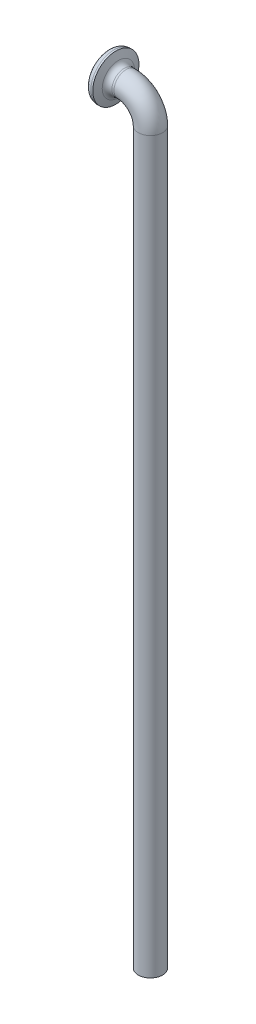
ISO-10303-21;
HEADER;
FILE_DESCRIPTION(('STEP AP214'),'2;1');
FILE_NAME('part.step','',(''),(''),'','','');
FILE_SCHEMA(('AUTOMOTIVE_DESIGN { 1 0 10303 214 1 1 1 1 }'));
ENDSEC;
DATA;
#1=APPLICATION_CONTEXT('core data for automotive mechanical design processes');
#2=APPLICATION_PROTOCOL_DEFINITION('international standard','automotive_design',2000,#1);
#3=PRODUCT_CONTEXT('',#1,'mechanical');
#4=PRODUCT('Part','Part','',(#3));
#5=PRODUCT_RELATED_PRODUCT_CATEGORY('part','',(#4));
#6=PRODUCT_DEFINITION_FORMATION('','',#4);
#7=PRODUCT_DEFINITION_CONTEXT('part definition',#1,'design');
#8=PRODUCT_DEFINITION('design','',#6,#7);
#9=PRODUCT_DEFINITION_SHAPE('','',#8);
#10=(LENGTH_UNIT() NAMED_UNIT(*) SI_UNIT(.MILLI.,.METRE.));
#11=(NAMED_UNIT(*) PLANE_ANGLE_UNIT() SI_UNIT($,.RADIAN.));
#12=(NAMED_UNIT(*) SI_UNIT($,.STERADIAN.) SOLID_ANGLE_UNIT());
#13=UNCERTAINTY_MEASURE_WITH_UNIT(LENGTH_MEASURE(1.E-05),#10,'distance_accuracy_value','');
#14=(GEOMETRIC_REPRESENTATION_CONTEXT(3) GLOBAL_UNCERTAINTY_ASSIGNED_CONTEXT((#13)) GLOBAL_UNIT_ASSIGNED_CONTEXT((#10,
#11,#12)) REPRESENTATION_CONTEXT('',''));
#15=CARTESIAN_POINT('',(0.,0.,0.));
#16=DIRECTION('',(0.,0.,1.));
#17=DIRECTION('',(1.,0.,0.));
#18=AXIS2_PLACEMENT_3D('',#15,#16,#17);
#19=CARTESIAN_POINT('',(-2.,62.,0.));
#20=DIRECTION('',(-1.,0.,0.));
#21=DIRECTION('',(0.,-1.,0.));
#22=AXIS2_PLACEMENT_3D('',#19,#20,#21);
#23=CYLINDRICAL_SURFACE('',#22,1.);
#24=CARTESIAN_POINT('',(-2.16827837145488,62.,0.));
#25=DIRECTION('',(1.,0.,0.));
#26=DIRECTION('',(0.,1.,0.));
#27=AXIS2_PLACEMENT_3D('',#24,#25,#26);
#28=CIRCLE('',#27,1.);
#29=CARTESIAN_POINT('',(-2.16827837145487,63.,0.));
#30=VERTEX_POINT('',#29);
#31=EDGE_CURVE('E58',#30,#30,#28,.T.);
#32=ORIENTED_EDGE('',*,*,#31,.T.);
#33=EDGE_LOOP('',(#32));
#34=FACE_BOUND('',#33,.T.);
#35=CARTESIAN_POINT('',(-1.9999999999997,62.,0.));
#36=DIRECTION('',(1.,0.,0.));
#37=DIRECTION('',(0.,1.,0.));
#38=AXIS2_PLACEMENT_3D('',#35,#36,#37);
#39=CIRCLE('',#38,1.);
#40=CARTESIAN_POINT('',(-1.99999999999955,63.,0.));
#41=VERTEX_POINT('',#40);
#42=EDGE_CURVE('E74',#41,#41,#39,.T.);
#43=ORIENTED_EDGE('',*,*,#42,.F.);
#44=EDGE_LOOP('',(#43));
#45=FACE_BOUND('',#44,.T.);
#46=ADVANCED_FACE('F51',(#34,#45),#23,.T.);
#47=CARTESIAN_POINT('',(0.,0.,0.));
#48=DIRECTION('',(0.,-1.,0.));
#49=DIRECTION('',(1.,0.,0.));
#50=AXIS2_PLACEMENT_3D('',#47,#48,#49);
#51=PLANE('',#50);
#52=CARTESIAN_POINT('',(0.,0.,0.));
#53=DIRECTION('',(0.,-1.,0.));
#54=DIRECTION('',(1.,0.,0.));
#55=AXIS2_PLACEMENT_3D('',#52,#53,#54);
#56=CIRCLE('',#55,1.);
#57=CARTESIAN_POINT('',(1.,0.,0.));
#58=VERTEX_POINT('',#57);
#59=EDGE_CURVE('E80',#58,#58,#56,.T.);
#60=ORIENTED_EDGE('',*,*,#59,.T.);
#61=EDGE_LOOP('',(#60));
#62=FACE_BOUND('',#61,.T.);
#63=ADVANCED_FACE('F84',(#62),#51,.T.);
#64=CARTESIAN_POINT('',(0.,0.,0.));
#65=DIRECTION('',(0.,1.,0.));
#66=DIRECTION('',(0.,0.,1.));
#67=AXIS2_PLACEMENT_3D('',#64,#65,#66);
#68=CYLINDRICAL_SURFACE('',#67,1.);
#69=CARTESIAN_POINT('',(0.,60.,0.));
#70=DIRECTION('',(0.,-1.,0.));
#71=DIRECTION('',(1.,0.,0.));
#72=AXIS2_PLACEMENT_3D('',#69,#70,#71);
#73=CIRCLE('',#72,1.);
#74=CARTESIAN_POINT('',(1.,60.,0.));
#75=VERTEX_POINT('',#74);
#76=EDGE_CURVE('E77',#75,#75,#73,.T.);
#77=ORIENTED_EDGE('',*,*,#76,.T.);
#78=EDGE_LOOP('',(#77));
#79=FACE_BOUND('',#78,.T.);
#80=ORIENTED_EDGE('',*,*,#59,.F.);
#81=EDGE_LOOP('',(#80));
#82=FACE_BOUND('',#81,.T.);
#83=ADVANCED_FACE('F86',(#79,#82),#68,.T.);
#84=CARTESIAN_POINT('',(-2.,60.,0.));
#85=DIRECTION('',(0.,0.,1.));
#86=DIRECTION('',(1.,0.,0.));
#87=AXIS2_PLACEMENT_3D('',#84,#85,#86);
#88=TOROIDAL_SURFACE('',#87,2.,1.);
#89=CARTESIAN_POINT('',(-2.,60.,0.));
#90=DIRECTION('',(0.,0.,1.));
#91=DIRECTION('',(1.,0.,0.));
#92=AXIS2_PLACEMENT_3D('',#89,#90,#91);
#93=CIRCLE('',#92,3.);
#94=EDGE_CURVE('',#75,#41,#93,.T.);
#95=ORIENTED_EDGE('',*,*,#76,.F.);
#96=ORIENTED_EDGE('',*,*,#42,.T.);
#97=ORIENTED_EDGE('',*,*,#94,.T.);
#98=ORIENTED_EDGE('',*,*,#94,.F.);
#99=EDGE_LOOP('',(#95,#97,#96,#98));
#100=FACE_BOUND('',#99,.T.);
#101=ADVANCED_FACE('F88',(#100),#88,.T.);
#102=CARTESIAN_POINT('',(-2.3,62.,0.));
#103=DIRECTION('',(-1.,0.,0.));
#104=DIRECTION('',(0.,-1.,0.));
#105=AXIS2_PLACEMENT_3D('',#102,#103,#104);
#106=CYLINDRICAL_SURFACE('',#105,1.9);
#107=CARTESIAN_POINT('',(-3.,62.,0.));
#108=DIRECTION('',(1.,0.,0.));
#109=DIRECTION('',(0.,1.,0.));
#110=AXIS2_PLACEMENT_3D('',#107,#108,#109);
#111=CIRCLE('',#110,1.9);
#112=CARTESIAN_POINT('',(-2.99999999999997,63.9,0.));
#113=VERTEX_POINT('',#112);
#114=EDGE_CURVE('E62',#113,#113,#111,.T.);
#115=ORIENTED_EDGE('',*,*,#114,.T.);
#116=EDGE_LOOP('',(#115));
#117=FACE_BOUND('',#116,.T.);
#118=CARTESIAN_POINT('',(-2.84595535139932,62.,0.));
#119=DIRECTION('',(-1.,0.,0.));
#120=DIRECTION('',(0.,-1.,0.));
#121=AXIS2_PLACEMENT_3D('',#118,#119,#120);
#122=CIRCLE('',#121,1.9);
#123=CARTESIAN_POINT('',(-2.84595535139934,60.1,0.));
#124=VERTEX_POINT('',#123);
#125=EDGE_CURVE('E71',#124,#124,#122,.T.);
#126=ORIENTED_EDGE('',*,*,#125,.T.);
#127=EDGE_LOOP('',(#126));
#128=FACE_BOUND('',#127,.T.);
#129=ADVANCED_FACE('F95',(#117,#128),#106,.T.);
#130=CARTESIAN_POINT('',(-3.5,62.,0.));
#131=DIRECTION('',(1.,0.,0.));
#132=DIRECTION('',(0.,1.,0.));
#133=AXIS2_PLACEMENT_3D('',#130,#131,#132);
#134=PLANE('',#133);
#135=CARTESIAN_POINT('',(-3.5,62.,0.));
#136=DIRECTION('',(1.,0.,0.));
#137=DIRECTION('',(0.,1.,0.));
#138=AXIS2_PLACEMENT_3D('',#135,#136,#137);
#139=CIRCLE('',#138,1.4);
#140=CARTESIAN_POINT('',(-3.49999999999998,63.4,0.));
#141=VERTEX_POINT('',#140);
#142=EDGE_CURVE('E66',#141,#141,#139,.F.);
#143=ORIENTED_EDGE('',*,*,#142,.T.);
#144=EDGE_LOOP('',(#143));
#145=FACE_BOUND('',#144,.T.);
#146=ADVANCED_FACE('F107',(#145),#134,.F.);
#147=CARTESIAN_POINT('',(-2.84595535139932,62.,0.));
#148=DIRECTION('',(-1.,0.,0.));
#149=DIRECTION('',(0.,-1.,0.));
#150=AXIS2_PLACEMENT_3D('',#147,#148,#149);
#151=CONICAL_SURFACE('',#150,1.9,1.22173047639602);
#152=CARTESIAN_POINT('',(-2.63812468184783,62.,0.));
#153=DIRECTION('',(1.,0.,0.));
#154=DIRECTION('',(0.,1.,0.));
#155=AXIS2_PLACEMENT_3D('',#152,#153,#154);
#156=CIRCLE('',#155,1.32898992833716);
#157=CARTESIAN_POINT('',(-2.63812468184782,63.3289899283372,0.));
#158=VERTEX_POINT('',#157);
#159=EDGE_CURVE('E11',#158,#158,#156,.F.);
#160=ORIENTED_EDGE('',*,*,#159,.T.);
#161=EDGE_LOOP('',(#160));
#162=FACE_BOUND('',#161,.T.);
#163=ORIENTED_EDGE('',*,*,#125,.F.);
#164=EDGE_LOOP('',(#163));
#165=FACE_BOUND('',#164,.T.);
#166=ADVANCED_FACE('F109',(#162,#165),#151,.T.);
#167=CARTESIAN_POINT('',(-3.,62.,0.));
#168=DIRECTION('',(1.,0.,0.));
#169=DIRECTION('',(0.,1.,0.));
#170=AXIS2_PLACEMENT_3D('',#167,#168,#169);
#171=TOROIDAL_SURFACE('',#170,1.4,0.5);
#172=ORIENTED_EDGE('',*,*,#114,.F.);
#173=EDGE_LOOP('',(#172));
#174=FACE_BOUND('',#173,.T.);
#175=ORIENTED_EDGE('',*,*,#142,.F.);
#176=EDGE_LOOP('',(#175));
#177=FACE_BOUND('',#176,.T.);
#178=ADVANCED_FACE('F116',(#174,#177),#171,.T.);
#179=CARTESIAN_POINT('',(-2.16827837145487,62.,0.));
#180=DIRECTION('',(1.,0.,0.));
#181=DIRECTION('',(0.,1.,0.));
#182=AXIS2_PLACEMENT_3D('',#179,#180,#181);
#183=TOROIDAL_SURFACE('',#182,1.5,0.5);
#184=ORIENTED_EDGE('',*,*,#159,.F.);
#185=EDGE_LOOP('',(#184));
#186=FACE_BOUND('',#185,.T.);
#187=ORIENTED_EDGE('',*,*,#31,.F.);
#188=EDGE_LOOP('',(#187));
#189=FACE_BOUND('',#188,.T.);
#190=ADVANCED_FACE('F53',(#186,#189),#183,.F.);
#191=CLOSED_SHELL('',(#46,#63,#83,#101,#129,#146,#166,#178,#190));
#192=MANIFOLD_SOLID_BREP('B2',#191);
#193=ADVANCED_BREP_SHAPE_REPRESENTATION('',(#18,#192),#14);
#194=SHAPE_DEFINITION_REPRESENTATION(#9,#193);
ENDSEC;
END-ISO-10303-21;
